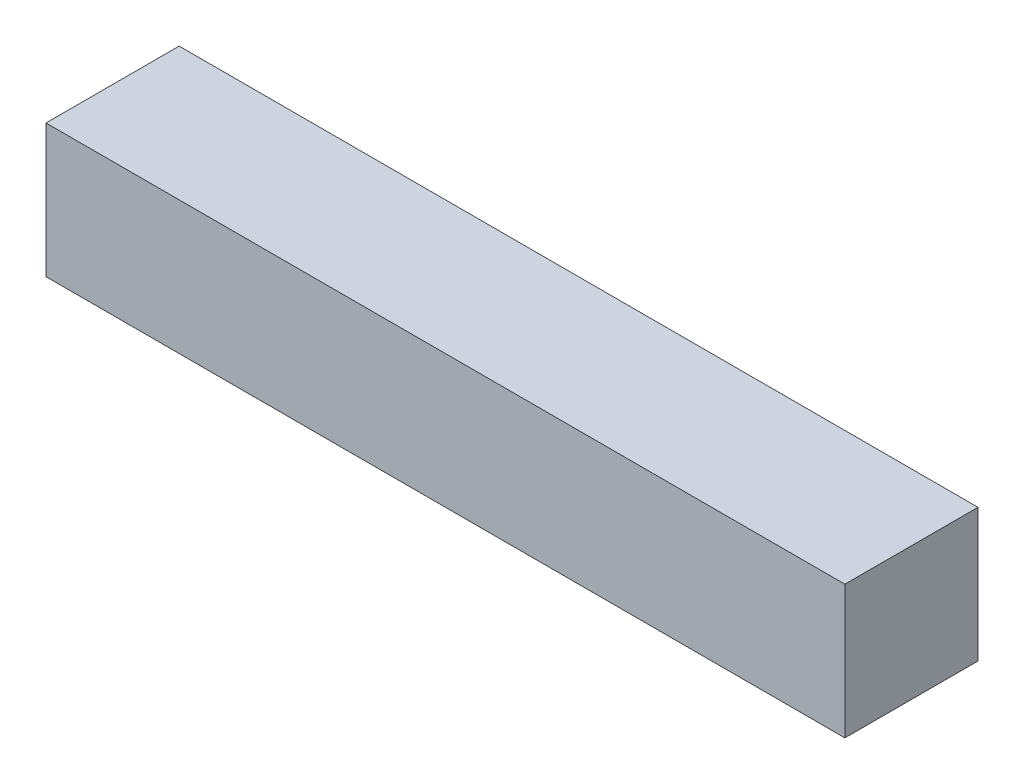
ISO-10303-21;
HEADER;
FILE_DESCRIPTION(('STEP AP214'),'2;1');
FILE_NAME('part.step','',(''),(''),'','','');
FILE_SCHEMA(('AUTOMOTIVE_DESIGN { 1 0 10303 214 1 1 1 1 }'));
ENDSEC;
DATA;
#1=APPLICATION_CONTEXT('core data for automotive mechanical design processes');
#2=APPLICATION_PROTOCOL_DEFINITION('international standard','automotive_design',2000,#1);
#3=PRODUCT_CONTEXT('',#1,'mechanical');
#4=PRODUCT('Part','Part','',(#3));
#5=PRODUCT_RELATED_PRODUCT_CATEGORY('part','',(#4));
#6=PRODUCT_DEFINITION_FORMATION('','',#4);
#7=PRODUCT_DEFINITION_CONTEXT('part definition',#1,'design');
#8=PRODUCT_DEFINITION('design','',#6,#7);
#9=PRODUCT_DEFINITION_SHAPE('','',#8);
#10=(LENGTH_UNIT() NAMED_UNIT(*) SI_UNIT(.MILLI.,.METRE.));
#11=(NAMED_UNIT(*) PLANE_ANGLE_UNIT() SI_UNIT($,.RADIAN.));
#12=(NAMED_UNIT(*) SI_UNIT($,.STERADIAN.) SOLID_ANGLE_UNIT());
#13=UNCERTAINTY_MEASURE_WITH_UNIT(LENGTH_MEASURE(1.E-05),#10,'distance_accuracy_value','');
#14=(GEOMETRIC_REPRESENTATION_CONTEXT(3) GLOBAL_UNCERTAINTY_ASSIGNED_CONTEXT((#13)) GLOBAL_UNIT_ASSIGNED_CONTEXT((#10,
#11,#12)) REPRESENTATION_CONTEXT('',''));
#15=CARTESIAN_POINT('',(0.,0.,0.));
#16=DIRECTION('',(0.,0.,1.));
#17=DIRECTION('',(1.,0.,0.));
#18=AXIS2_PLACEMENT_3D('',#15,#16,#17);
#19=CARTESIAN_POINT('',(15.,2.5,5.));
#20=DIRECTION('',(-1.,0.,0.));
#21=DIRECTION('',(0.,0.,1.));
#22=AXIS2_PLACEMENT_3D('',#19,#20,#21);
#23=PLANE('',#22);
#24=DIRECTION('',(0.,1.,0.));
#25=VECTOR('',#24,1.);
#26=CARTESIAN_POINT('',(15.,2.5,0.));
#27=LINE('',#26,#25);
#28=CARTESIAN_POINT('',(15.,-2.5,0.));
#29=VERTEX_POINT('',#28);
#30=CARTESIAN_POINT('',(15.,2.5,0.));
#31=VERTEX_POINT('',#30);
#32=EDGE_CURVE('E96',#29,#31,#27,.T.);
#33=ORIENTED_EDGE('',*,*,#32,.T.);
#34=DIRECTION('',(0.,0.,-1.));
#35=VECTOR('',#34,1.);
#36=CARTESIAN_POINT('',(15.,2.5,5.));
#37=LINE('',#36,#35);
#38=CARTESIAN_POINT('',(15.,2.5,5.));
#39=VERTEX_POINT('',#38);
#40=EDGE_CURVE('E11',#39,#31,#37,.T.);
#41=ORIENTED_EDGE('',*,*,#40,.F.);
#42=DIRECTION('',(0.,1.,0.));
#43=VECTOR('',#42,1.);
#44=CARTESIAN_POINT('',(15.,2.5,5.));
#45=LINE('',#44,#43);
#46=CARTESIAN_POINT('',(15.,-2.5,5.));
#47=VERTEX_POINT('',#46);
#48=EDGE_CURVE('E84',#47,#39,#45,.T.);
#49=ORIENTED_EDGE('',*,*,#48,.F.);
#50=DIRECTION('',(0.,0.,-1.));
#51=VECTOR('',#50,1.);
#52=CARTESIAN_POINT('',(15.,-2.5,5.));
#53=LINE('',#52,#51);
#54=EDGE_CURVE('E92',#47,#29,#53,.T.);
#55=ORIENTED_EDGE('',*,*,#54,.T.);
#56=EDGE_LOOP('',(#33,#41,#49,#55));
#57=FACE_BOUND('',#56,.T.);
#58=ADVANCED_FACE('F33',(#57),#23,.F.);
#59=CARTESIAN_POINT('',(-15.,2.5,5.));
#60=DIRECTION('',(0.,-1.,0.));
#61=DIRECTION('',(0.,0.,-1.));
#62=AXIS2_PLACEMENT_3D('',#59,#60,#61);
#63=PLANE('',#62);
#64=DIRECTION('',(-1.,0.,0.));
#65=VECTOR('',#64,1.);
#66=CARTESIAN_POINT('',(-15.,2.5,0.));
#67=LINE('',#66,#65);
#68=CARTESIAN_POINT('',(-15.,2.5,0.));
#69=VERTEX_POINT('',#68);
#70=EDGE_CURVE('E88',#31,#69,#67,.T.);
#71=ORIENTED_EDGE('',*,*,#70,.T.);
#72=DIRECTION('',(0.,0.,-1.));
#73=VECTOR('',#72,1.);
#74=CARTESIAN_POINT('',(-15.,2.5,5.));
#75=LINE('',#74,#73);
#76=CARTESIAN_POINT('',(-15.,2.5,5.));
#77=VERTEX_POINT('',#76);
#78=EDGE_CURVE('E41',#77,#69,#75,.T.);
#79=ORIENTED_EDGE('',*,*,#78,.F.);
#80=DIRECTION('',(-1.,0.,0.));
#81=VECTOR('',#80,1.);
#82=CARTESIAN_POINT('',(-15.,2.5,5.));
#83=LINE('',#82,#81);
#84=EDGE_CURVE('E79',#39,#77,#83,.T.);
#85=ORIENTED_EDGE('',*,*,#84,.F.);
#86=ORIENTED_EDGE('',*,*,#40,.T.);
#87=EDGE_LOOP('',(#71,#79,#85,#86));
#88=FACE_BOUND('',#87,.T.);
#89=ADVANCED_FACE('F87',(#88),#63,.F.);
#90=CARTESIAN_POINT('',(-15.,2.5,5.));
#91=DIRECTION('',(1.,0.,0.));
#92=DIRECTION('',(0.,0.,-1.));
#93=AXIS2_PLACEMENT_3D('',#90,#91,#92);
#94=PLANE('',#93);
#95=DIRECTION('',(0.,-1.,0.));
#96=VECTOR('',#95,1.);
#97=CARTESIAN_POINT('',(-15.,2.5,0.));
#98=LINE('',#97,#96);
#99=CARTESIAN_POINT('',(-15.,-2.5,0.));
#100=VERTEX_POINT('',#99);
#101=EDGE_CURVE('E66',#69,#100,#98,.T.);
#102=ORIENTED_EDGE('',*,*,#101,.T.);
#103=DIRECTION('',(0.,0.,-1.));
#104=VECTOR('',#103,1.);
#105=CARTESIAN_POINT('',(-15.,-2.5,5.));
#106=LINE('',#105,#104);
#107=CARTESIAN_POINT('',(-15.,-2.5,5.));
#108=VERTEX_POINT('',#107);
#109=EDGE_CURVE('E89',#108,#100,#106,.T.);
#110=ORIENTED_EDGE('',*,*,#109,.F.);
#111=DIRECTION('',(0.,-1.,0.));
#112=VECTOR('',#111,1.);
#113=CARTESIAN_POINT('',(-15.,2.5,5.));
#114=LINE('',#113,#112);
#115=EDGE_CURVE('E82',#77,#108,#114,.T.);
#116=ORIENTED_EDGE('',*,*,#115,.F.);
#117=ORIENTED_EDGE('',*,*,#78,.T.);
#118=EDGE_LOOP('',(#102,#110,#116,#117));
#119=FACE_BOUND('',#118,.T.);
#120=ADVANCED_FACE('F90',(#119),#94,.F.);
#121=CARTESIAN_POINT('',(-15.,-2.5,5.));
#122=DIRECTION('',(0.,1.,0.));
#123=DIRECTION('',(0.,0.,1.));
#124=AXIS2_PLACEMENT_3D('',#121,#122,#123);
#125=PLANE('',#124);
#126=DIRECTION('',(1.,0.,0.));
#127=VECTOR('',#126,1.);
#128=CARTESIAN_POINT('',(-15.,-2.5,0.));
#129=LINE('',#128,#127);
#130=EDGE_CURVE('E72',#100,#29,#129,.T.);
#131=ORIENTED_EDGE('',*,*,#130,.T.);
#132=ORIENTED_EDGE('',*,*,#54,.F.);
#133=DIRECTION('',(1.,0.,0.));
#134=VECTOR('',#133,1.);
#135=CARTESIAN_POINT('',(-15.,-2.5,5.));
#136=LINE('',#135,#134);
#137=EDGE_CURVE('E49',#108,#47,#136,.T.);
#138=ORIENTED_EDGE('',*,*,#137,.F.);
#139=ORIENTED_EDGE('',*,*,#109,.T.);
#140=EDGE_LOOP('',(#131,#132,#138,#139));
#141=FACE_BOUND('',#140,.T.);
#142=ADVANCED_FACE('F103',(#141),#125,.F.);
#143=CARTESIAN_POINT('',(0.,0.,5.));
#144=DIRECTION('',(0.,0.,1.));
#145=DIRECTION('',(1.,0.,0.));
#146=AXIS2_PLACEMENT_3D('',#143,#144,#145);
#147=PLANE('',#146);
#148=ORIENTED_EDGE('',*,*,#48,.T.);
#149=ORIENTED_EDGE('',*,*,#84,.T.);
#150=ORIENTED_EDGE('',*,*,#115,.T.);
#151=ORIENTED_EDGE('',*,*,#137,.T.);
#152=EDGE_LOOP('',(#148,#149,#150,#151));
#153=FACE_BOUND('',#152,.T.);
#154=ADVANCED_FACE('F80',(#153),#147,.T.);
#155=CARTESIAN_POINT('',(0.,0.,0.));
#156=DIRECTION('',(0.,0.,1.));
#157=DIRECTION('',(1.,0.,0.));
#158=AXIS2_PLACEMENT_3D('',#155,#156,#157);
#159=PLANE('',#158);
#160=ORIENTED_EDGE('',*,*,#32,.F.);
#161=ORIENTED_EDGE('',*,*,#130,.F.);
#162=ORIENTED_EDGE('',*,*,#101,.F.);
#163=ORIENTED_EDGE('',*,*,#70,.F.);
#164=EDGE_LOOP('',(#160,#161,#162,#163));
#165=FACE_BOUND('',#164,.T.);
#166=ADVANCED_FACE('F106',(#165),#159,.F.);
#167=CLOSED_SHELL('',(#58,#89,#120,#142,#154,#166));
#168=MANIFOLD_SOLID_BREP('B2',#167);
#169=ADVANCED_BREP_SHAPE_REPRESENTATION('',(#18,#168),#14);
#170=SHAPE_DEFINITION_REPRESENTATION(#9,#169);
ENDSEC;
END-ISO-10303-21;
